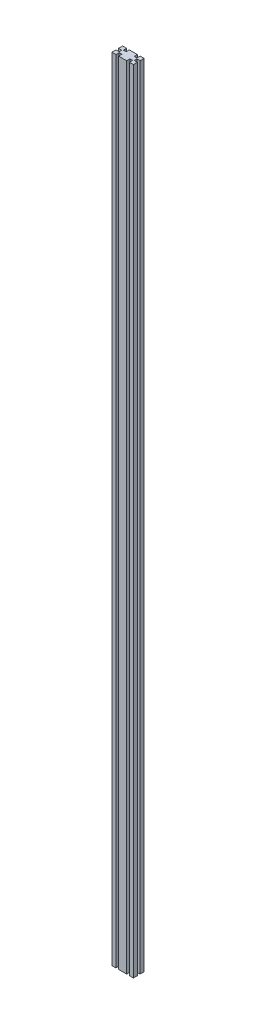
ISO-10303-21;
HEADER;
FILE_DESCRIPTION(('STEP AP214'),'2;1');
FILE_NAME('part.step','',(''),(''),'','','');
FILE_SCHEMA(('AUTOMOTIVE_DESIGN { 1 0 10303 214 1 1 1 1 }'));
ENDSEC;
DATA;
#1=APPLICATION_CONTEXT('core data for automotive mechanical design processes');
#2=APPLICATION_PROTOCOL_DEFINITION('international standard','automotive_design',2000,#1);
#3=PRODUCT_CONTEXT('',#1,'mechanical');
#4=PRODUCT('Part','Part','',(#3));
#5=PRODUCT_RELATED_PRODUCT_CATEGORY('part','',(#4));
#6=PRODUCT_DEFINITION_FORMATION('','',#4);
#7=PRODUCT_DEFINITION_CONTEXT('part definition',#1,'design');
#8=PRODUCT_DEFINITION('design','',#6,#7);
#9=PRODUCT_DEFINITION_SHAPE('','',#8);
#10=(LENGTH_UNIT() NAMED_UNIT(*) SI_UNIT(.MILLI.,.METRE.));
#11=(NAMED_UNIT(*) PLANE_ANGLE_UNIT() SI_UNIT($,.RADIAN.));
#12=(NAMED_UNIT(*) SI_UNIT($,.STERADIAN.) SOLID_ANGLE_UNIT());
#13=UNCERTAINTY_MEASURE_WITH_UNIT(LENGTH_MEASURE(1.E-05),#10,'distance_accuracy_value','');
#14=(GEOMETRIC_REPRESENTATION_CONTEXT(3) GLOBAL_UNCERTAINTY_ASSIGNED_CONTEXT((#13)) GLOBAL_UNIT_ASSIGNED_CONTEXT((#10,
#11,#12)) REPRESENTATION_CONTEXT('',''));
#15=CARTESIAN_POINT('',(0.,0.,0.));
#16=DIRECTION('',(0.,0.,1.));
#17=DIRECTION('',(1.,0.,0.));
#18=AXIS2_PLACEMENT_3D('',#15,#16,#17);
#19=CARTESIAN_POINT('',(20.,-736.6,10.));
#20=DIRECTION('',(1.,0.,0.));
#21=DIRECTION('',(0.,0.,-1.));
#22=AXIS2_PLACEMENT_3D('',#19,#20,#21);
#23=PLANE('',#22);
#24=DIRECTION('',(0.,0.,-1.));
#25=VECTOR('',#24,1.);
#26=CARTESIAN_POINT('',(20.,736.6,10.));
#27=LINE('',#26,#25);
#28=CARTESIAN_POINT('',(20.,736.6,-2.5));
#29=VERTEX_POINT('',#28);
#30=CARTESIAN_POINT('',(20.,736.6,-10.));
#31=VERTEX_POINT('',#30);
#32=EDGE_CURVE('E374',#29,#31,#27,.T.);
#33=ORIENTED_EDGE('',*,*,#32,.F.);
#34=DIRECTION('',(0.,-1.,0.));
#35=VECTOR('',#34,1.);
#36=CARTESIAN_POINT('',(20.,-736.6,-2.5));
#37=LINE('',#36,#35);
#38=CARTESIAN_POINT('',(20.,-736.6,-2.5));
#39=VERTEX_POINT('',#38);
#40=EDGE_CURVE('E356',#29,#39,#37,.T.);
#41=ORIENTED_EDGE('',*,*,#40,.T.);
#42=DIRECTION('',(0.,0.,-1.));
#43=VECTOR('',#42,1.);
#44=CARTESIAN_POINT('',(20.,-736.6,10.));
#45=LINE('',#44,#43);
#46=CARTESIAN_POINT('',(20.,-736.6,-10.));
#47=VERTEX_POINT('',#46);
#48=EDGE_CURVE('E391',#39,#47,#45,.T.);
#49=ORIENTED_EDGE('',*,*,#48,.T.);
#50=DIRECTION('',(0.,1.,0.));
#51=VECTOR('',#50,1.);
#52=CARTESIAN_POINT('',(20.,-736.6,-10.));
#53=LINE('',#52,#51);
#54=EDGE_CURVE('E36',#47,#31,#53,.T.);
#55=ORIENTED_EDGE('',*,*,#54,.T.);
#56=EDGE_LOOP('',(#33,#41,#49,#55));
#57=FACE_BOUND('',#56,.T.);
#58=ADVANCED_FACE('F32',(#57),#23,.T.);
#59=CARTESIAN_POINT('',(-20.,-736.6,10.));
#60=DIRECTION('',(0.,0.,1.));
#61=DIRECTION('',(1.,0.,0.));
#62=AXIS2_PLACEMENT_3D('',#59,#60,#61);
#63=PLANE('',#62);
#64=DIRECTION('',(1.,0.,0.));
#65=VECTOR('',#64,1.);
#66=CARTESIAN_POINT('',(-20.,736.6,10.));
#67=LINE('',#66,#65);
#68=CARTESIAN_POINT('',(-7.5,736.6,10.));
#69=VERTEX_POINT('',#68);
#70=CARTESIAN_POINT('',(7.5,736.6,10.));
#71=VERTEX_POINT('',#70);
#72=EDGE_CURVE('E392',#69,#71,#67,.T.);
#73=ORIENTED_EDGE('',*,*,#72,.F.);
#74=DIRECTION('',(0.,-1.,0.));
#75=VECTOR('',#74,1.);
#76=CARTESIAN_POINT('',(-7.5,-736.6,10.));
#77=LINE('',#76,#75);
#78=CARTESIAN_POINT('',(-7.5,-736.6,10.));
#79=VERTEX_POINT('',#78);
#80=EDGE_CURVE('E371',#69,#79,#77,.T.);
#81=ORIENTED_EDGE('',*,*,#80,.T.);
#82=DIRECTION('',(1.,0.,0.));
#83=VECTOR('',#82,1.);
#84=CARTESIAN_POINT('',(-20.,-736.6,10.));
#85=LINE('',#84,#83);
#86=CARTESIAN_POINT('',(7.5,-736.6,10.));
#87=VERTEX_POINT('',#86);
#88=EDGE_CURVE('E408',#79,#87,#85,.T.);
#89=ORIENTED_EDGE('',*,*,#88,.T.);
#90=DIRECTION('',(0.,-1.,0.));
#91=VECTOR('',#90,1.);
#92=CARTESIAN_POINT('',(7.5,-736.6,10.));
#93=LINE('',#92,#91);
#94=EDGE_CURVE('E351',#71,#87,#93,.T.);
#95=ORIENTED_EDGE('',*,*,#94,.F.);
#96=EDGE_LOOP('',(#73,#81,#89,#95));
#97=FACE_BOUND('',#96,.T.);
#98=ADVANCED_FACE('F492',(#97),#63,.T.);
#99=CARTESIAN_POINT('',(12.5,736.6,10.));
#100=VERTEX_POINT('',#99);
#101=CARTESIAN_POINT('',(20.,736.6,10.));
#102=VERTEX_POINT('',#101);
#103=EDGE_CURVE('E387',#100,#102,#67,.T.);
#104=ORIENTED_EDGE('',*,*,#103,.F.);
#105=DIRECTION('',(0.,-1.,0.));
#106=VECTOR('',#105,1.);
#107=CARTESIAN_POINT('',(12.5,-736.6,10.));
#108=LINE('',#107,#106);
#109=CARTESIAN_POINT('',(12.5,-736.6,10.));
#110=VERTEX_POINT('',#109);
#111=EDGE_CURVE('E235',#100,#110,#108,.T.);
#112=ORIENTED_EDGE('',*,*,#111,.T.);
#113=CARTESIAN_POINT('',(20.,-736.6,10.));
#114=VERTEX_POINT('',#113);
#115=EDGE_CURVE('E405',#110,#114,#85,.T.);
#116=ORIENTED_EDGE('',*,*,#115,.T.);
#117=DIRECTION('',(0.,1.,0.));
#118=VECTOR('',#117,1.);
#119=CARTESIAN_POINT('',(20.,-736.6,10.));
#120=LINE('',#119,#118);
#121=EDGE_CURVE('E11',#114,#102,#120,.T.);
#122=ORIENTED_EDGE('',*,*,#121,.T.);
#123=EDGE_LOOP('',(#104,#112,#116,#122));
#124=FACE_BOUND('',#123,.T.);
#125=ADVANCED_FACE('F496',(#124),#63,.T.);
#126=CARTESIAN_POINT('',(-20.,-736.6,10.));
#127=DIRECTION('',(-1.,0.,0.));
#128=DIRECTION('',(0.,0.,1.));
#129=AXIS2_PLACEMENT_3D('',#126,#127,#128);
#130=PLANE('',#129);
#131=DIRECTION('',(0.,0.,1.));
#132=VECTOR('',#131,1.);
#133=CARTESIAN_POINT('',(-20.,736.6,10.));
#134=LINE('',#133,#132);
#135=CARTESIAN_POINT('',(-20.,736.6,2.5));
#136=VERTEX_POINT('',#135);
#137=CARTESIAN_POINT('',(-20.,736.6,10.));
#138=VERTEX_POINT('',#137);
#139=EDGE_CURVE('E382',#136,#138,#134,.T.);
#140=ORIENTED_EDGE('',*,*,#139,.F.);
#141=DIRECTION('',(0.,-1.,0.));
#142=VECTOR('',#141,1.);
#143=CARTESIAN_POINT('',(-20.,-736.6,2.5));
#144=LINE('',#143,#142);
#145=CARTESIAN_POINT('',(-20.,-736.6,2.5));
#146=VERTEX_POINT('',#145);
#147=EDGE_CURVE('E364',#136,#146,#144,.T.);
#148=ORIENTED_EDGE('',*,*,#147,.T.);
#149=DIRECTION('',(0.,0.,1.));
#150=VECTOR('',#149,1.);
#151=CARTESIAN_POINT('',(-20.,-736.6,10.));
#152=LINE('',#151,#150);
#153=CARTESIAN_POINT('',(-20.,-736.6,10.));
#154=VERTEX_POINT('',#153);
#155=EDGE_CURVE('E400',#146,#154,#152,.T.);
#156=ORIENTED_EDGE('',*,*,#155,.T.);
#157=DIRECTION('',(0.,1.,0.));
#158=VECTOR('',#157,1.);
#159=CARTESIAN_POINT('',(-20.,-736.6,10.));
#160=LINE('',#159,#158);
#161=EDGE_CURVE('E41',#154,#138,#160,.T.);
#162=ORIENTED_EDGE('',*,*,#161,.T.);
#163=EDGE_LOOP('',(#140,#148,#156,#162));
#164=FACE_BOUND('',#163,.T.);
#165=ADVANCED_FACE('F688',(#164),#130,.T.);
#166=CARTESIAN_POINT('',(-20.,-736.6,-10.));
#167=DIRECTION('',(0.,0.,-1.));
#168=DIRECTION('',(-1.,0.,0.));
#169=AXIS2_PLACEMENT_3D('',#166,#167,#168);
#170=PLANE('',#169);
#171=DIRECTION('',(-1.,0.,0.));
#172=VECTOR('',#171,1.);
#173=CARTESIAN_POINT('',(-20.,736.6,-10.));
#174=LINE('',#173,#172);
#175=CARTESIAN_POINT('',(7.5,736.6,-10.));
#176=VERTEX_POINT('',#175);
#177=CARTESIAN_POINT('',(-7.5,736.6,-10.));
#178=VERTEX_POINT('',#177);
#179=EDGE_CURVE('E383',#176,#178,#174,.T.);
#180=ORIENTED_EDGE('',*,*,#179,.F.);
#181=DIRECTION('',(0.,-1.,0.));
#182=VECTOR('',#181,1.);
#183=CARTESIAN_POINT('',(7.5,-736.6,-10.));
#184=LINE('',#183,#182);
#185=CARTESIAN_POINT('',(7.5,-736.6,-10.));
#186=VERTEX_POINT('',#185);
#187=EDGE_CURVE('E361',#176,#186,#184,.T.);
#188=ORIENTED_EDGE('',*,*,#187,.T.);
#189=DIRECTION('',(-1.,0.,0.));
#190=VECTOR('',#189,1.);
#191=CARTESIAN_POINT('',(-20.,-736.6,-10.));
#192=LINE('',#191,#190);
#193=CARTESIAN_POINT('',(-7.5,-736.6,-10.));
#194=VERTEX_POINT('',#193);
#195=EDGE_CURVE('E401',#186,#194,#192,.T.);
#196=ORIENTED_EDGE('',*,*,#195,.T.);
#197=DIRECTION('',(0.,-1.,0.));
#198=VECTOR('',#197,1.);
#199=CARTESIAN_POINT('',(-7.5,-736.6,-10.));
#200=LINE('',#199,#198);
#201=EDGE_CURVE('E344',#178,#194,#200,.T.);
#202=ORIENTED_EDGE('',*,*,#201,.F.);
#203=EDGE_LOOP('',(#180,#188,#196,#202));
#204=FACE_BOUND('',#203,.T.);
#205=ADVANCED_FACE('F474',(#204),#170,.T.);
#206=CARTESIAN_POINT('',(-12.5,736.6,-10.));
#207=VERTEX_POINT('',#206);
#208=CARTESIAN_POINT('',(-20.,736.6,-10.));
#209=VERTEX_POINT('',#208);
#210=EDGE_CURVE('E378',#207,#209,#174,.T.);
#211=ORIENTED_EDGE('',*,*,#210,.F.);
#212=DIRECTION('',(0.,-1.,0.));
#213=VECTOR('',#212,1.);
#214=CARTESIAN_POINT('',(-12.5,-736.6,-10.));
#215=LINE('',#214,#213);
#216=CARTESIAN_POINT('',(-12.5,-736.6,-10.));
#217=VERTEX_POINT('',#216);
#218=EDGE_CURVE('E348',#207,#217,#215,.T.);
#219=ORIENTED_EDGE('',*,*,#218,.T.);
#220=CARTESIAN_POINT('',(-20.,-736.6,-10.));
#221=VERTEX_POINT('',#220);
#222=EDGE_CURVE('E396',#217,#221,#192,.T.);
#223=ORIENTED_EDGE('',*,*,#222,.T.);
#224=DIRECTION('',(0.,1.,0.));
#225=VECTOR('',#224,1.);
#226=CARTESIAN_POINT('',(-20.,-736.6,-10.));
#227=LINE('',#226,#225);
#228=EDGE_CURVE('E411',#221,#209,#227,.T.);
#229=ORIENTED_EDGE('',*,*,#228,.T.);
#230=EDGE_LOOP('',(#211,#219,#223,#229));
#231=FACE_BOUND('',#230,.T.);
#232=ADVANCED_FACE('F456',(#231),#170,.T.);
#233=CARTESIAN_POINT('',(0.,-736.6,0.));
#234=DIRECTION('',(0.,-1.,0.));
#235=DIRECTION('',(0.,0.,-1.));
#236=AXIS2_PLACEMENT_3D('',#233,#234,#235);
#237=PLANE('',#236);
#238=ORIENTED_EDGE('',*,*,#88,.F.);
#239=DIRECTION('',(0.,0.,1.));
#240=VECTOR('',#239,1.);
#241=CARTESIAN_POINT('',(-7.5,-736.6,0.));
#242=LINE('',#241,#240);
#243=CARTESIAN_POINT('',(-7.5,-736.6,4.));
#244=VERTEX_POINT('',#243);
#245=EDGE_CURVE('E265',#244,#79,#242,.T.);
#246=ORIENTED_EDGE('',*,*,#245,.F.);
#247=DIRECTION('',(1.,0.,0.));
#248=VECTOR('',#247,1.);
#249=CARTESIAN_POINT('',(0.,-736.6,4.));
#250=LINE('',#249,#248);
#251=CARTESIAN_POINT('',(-12.5,-736.6,4.));
#252=VERTEX_POINT('',#251);
#253=EDGE_CURVE('E260',#252,#244,#250,.T.);
#254=ORIENTED_EDGE('',*,*,#253,.F.);
#255=DIRECTION('',(0.,0.,1.));
#256=VECTOR('',#255,1.);
#257=CARTESIAN_POINT('',(-12.5,-736.6,0.));
#258=LINE('',#257,#256);
#259=CARTESIAN_POINT('',(-12.5,-736.6,10.));
#260=VERTEX_POINT('',#259);
#261=EDGE_CURVE('E262',#252,#260,#258,.T.);
#262=ORIENTED_EDGE('',*,*,#261,.T.);
#263=EDGE_CURVE('E406',#154,#260,#85,.T.);
#264=ORIENTED_EDGE('',*,*,#263,.F.);
#265=ORIENTED_EDGE('',*,*,#155,.F.);
#266=DIRECTION('',(-1.,0.,0.));
#267=VECTOR('',#266,1.);
#268=CARTESIAN_POINT('',(0.,-736.6,2.5));
#269=LINE('',#268,#267);
#270=CARTESIAN_POINT('',(-14.,-736.6,2.5));
#271=VERTEX_POINT('',#270);
#272=EDGE_CURVE('E284',#271,#146,#269,.T.);
#273=ORIENTED_EDGE('',*,*,#272,.F.);
#274=DIRECTION('',(0.,0.,1.));
#275=VECTOR('',#274,1.);
#276=CARTESIAN_POINT('',(-14.,-736.6,0.));
#277=LINE('',#276,#275);
#278=CARTESIAN_POINT('',(-14.,-736.6,-2.5));
#279=VERTEX_POINT('',#278);
#280=EDGE_CURVE('E286',#279,#271,#277,.T.);
#281=ORIENTED_EDGE('',*,*,#280,.F.);
#282=DIRECTION('',(-1.,0.,0.));
#283=VECTOR('',#282,1.);
#284=CARTESIAN_POINT('',(0.,-736.6,-2.5));
#285=LINE('',#284,#283);
#286=CARTESIAN_POINT('',(-20.,-736.6,-2.5));
#287=VERTEX_POINT('',#286);
#288=EDGE_CURVE('E281',#279,#287,#285,.T.);
#289=ORIENTED_EDGE('',*,*,#288,.T.);
#290=EDGE_CURVE('E402',#221,#287,#152,.T.);
#291=ORIENTED_EDGE('',*,*,#290,.F.);
#292=ORIENTED_EDGE('',*,*,#222,.F.);
#293=DIRECTION('',(0.,0.,-1.));
#294=VECTOR('',#293,1.);
#295=CARTESIAN_POINT('',(-12.5,-736.6,0.));
#296=LINE('',#295,#294);
#297=CARTESIAN_POINT('',(-12.5,-736.6,-4.));
#298=VERTEX_POINT('',#297);
#299=EDGE_CURVE('E339',#298,#217,#296,.T.);
#300=ORIENTED_EDGE('',*,*,#299,.F.);
#301=DIRECTION('',(1.,0.,0.));
#302=VECTOR('',#301,1.);
#303=CARTESIAN_POINT('',(0.,-736.6,-4.));
#304=LINE('',#303,#302);
#305=CARTESIAN_POINT('',(-7.5,-736.6,-4.));
#306=VERTEX_POINT('',#305);
#307=EDGE_CURVE('E333',#298,#306,#304,.T.);
#308=ORIENTED_EDGE('',*,*,#307,.T.);
#309=DIRECTION('',(0.,0.,-1.));
#310=VECTOR('',#309,1.);
#311=CARTESIAN_POINT('',(-7.5,-736.6,0.));
#312=LINE('',#311,#310);
#313=EDGE_CURVE('E336',#306,#194,#312,.T.);
#314=ORIENTED_EDGE('',*,*,#313,.T.);
#315=ORIENTED_EDGE('',*,*,#195,.F.);
#316=DIRECTION('',(0.,0.,-1.));
#317=VECTOR('',#316,1.);
#318=CARTESIAN_POINT('',(7.5,-736.6,0.));
#319=LINE('',#318,#317);
#320=CARTESIAN_POINT('',(7.5,-736.6,-4.));
#321=VERTEX_POINT('',#320);
#322=EDGE_CURVE('E303',#321,#186,#319,.T.);
#323=ORIENTED_EDGE('',*,*,#322,.F.);
#324=DIRECTION('',(-1.,0.,0.));
#325=VECTOR('',#324,1.);
#326=CARTESIAN_POINT('',(0.,-736.6,-4.));
#327=LINE('',#326,#325);
#328=CARTESIAN_POINT('',(12.5,-736.6,-4.));
#329=VERTEX_POINT('',#328);
#330=EDGE_CURVE('E298',#329,#321,#327,.T.);
#331=ORIENTED_EDGE('',*,*,#330,.F.);
#332=DIRECTION('',(0.,0.,-1.));
#333=VECTOR('',#332,1.);
#334=CARTESIAN_POINT('',(12.5,-736.6,0.));
#335=LINE('',#334,#333);
#336=CARTESIAN_POINT('',(12.5,-736.6,-10.));
#337=VERTEX_POINT('',#336);
#338=EDGE_CURVE('E300',#329,#337,#335,.T.);
#339=ORIENTED_EDGE('',*,*,#338,.T.);
#340=EDGE_CURVE('E397',#47,#337,#192,.T.);
#341=ORIENTED_EDGE('',*,*,#340,.F.);
#342=ORIENTED_EDGE('',*,*,#48,.F.);
#343=DIRECTION('',(1.,0.,0.));
#344=VECTOR('',#343,1.);
#345=CARTESIAN_POINT('',(0.,-736.6,-2.5));
#346=LINE('',#345,#344);
#347=CARTESIAN_POINT('',(14.,-736.6,-2.5));
#348=VERTEX_POINT('',#347);
#349=EDGE_CURVE('E315',#348,#39,#346,.T.);
#350=ORIENTED_EDGE('',*,*,#349,.F.);
#351=DIRECTION('',(0.,0.,1.));
#352=VECTOR('',#351,1.);
#353=CARTESIAN_POINT('',(14.,-736.6,0.));
#354=LINE('',#353,#352);
#355=CARTESIAN_POINT('',(14.,-736.6,2.5));
#356=VERTEX_POINT('',#355);
#357=EDGE_CURVE('E317',#348,#356,#354,.T.);
#358=ORIENTED_EDGE('',*,*,#357,.T.);
#359=DIRECTION('',(1.,0.,0.));
#360=VECTOR('',#359,1.);
#361=CARTESIAN_POINT('',(0.,-736.6,2.5));
#362=LINE('',#361,#360);
#363=CARTESIAN_POINT('',(20.,-736.6,2.5));
#364=VERTEX_POINT('',#363);
#365=EDGE_CURVE('E320',#356,#364,#362,.T.);
#366=ORIENTED_EDGE('',*,*,#365,.T.);
#367=EDGE_CURVE('E393',#114,#364,#45,.T.);
#368=ORIENTED_EDGE('',*,*,#367,.F.);
#369=ORIENTED_EDGE('',*,*,#115,.F.);
#370=DIRECTION('',(0.,0.,1.));
#371=VECTOR('',#370,1.);
#372=CARTESIAN_POINT('',(12.5,-736.6,0.));
#373=LINE('',#372,#371);
#374=CARTESIAN_POINT('',(12.5,-736.6,4.));
#375=VERTEX_POINT('',#374);
#376=EDGE_CURVE('E251',#375,#110,#373,.T.);
#377=ORIENTED_EDGE('',*,*,#376,.F.);
#378=DIRECTION('',(-1.,0.,0.));
#379=VECTOR('',#378,1.);
#380=CARTESIAN_POINT('',(0.,-736.6,4.));
#381=LINE('',#380,#379);
#382=CARTESIAN_POINT('',(7.5,-736.6,4.));
#383=VERTEX_POINT('',#382);
#384=EDGE_CURVE('E225',#375,#383,#381,.T.);
#385=ORIENTED_EDGE('',*,*,#384,.T.);
#386=DIRECTION('',(0.,0.,1.));
#387=VECTOR('',#386,1.);
#388=CARTESIAN_POINT('',(7.5,-736.6,0.));
#389=LINE('',#388,#387);
#390=EDGE_CURVE('E248',#383,#87,#389,.T.);
#391=ORIENTED_EDGE('',*,*,#390,.T.);
#392=EDGE_LOOP('',(#238,#246,#254,#262,#264,#265,#273,#281,#289,#291,#292,#300,#308,#314,#315,
#323,#331,#339,#341,#342,#350,#358,#366,#368,#369,#377,#385,#391));
#393=FACE_BOUND('',#392,.T.);
#394=ADVANCED_FACE('F439',(#393),#237,.T.);
#395=CARTESIAN_POINT('',(0.,736.6,0.));
#396=DIRECTION('',(0.,-1.,0.));
#397=DIRECTION('',(0.,0.,-1.));
#398=AXIS2_PLACEMENT_3D('',#395,#396,#397);
#399=PLANE('',#398);
#400=DIRECTION('',(0.,0.,1.));
#401=VECTOR('',#400,1.);
#402=CARTESIAN_POINT('',(-7.5,736.6,0.));
#403=LINE('',#402,#401);
#404=CARTESIAN_POINT('',(-7.5,736.6,4.));
#405=VERTEX_POINT('',#404);
#406=EDGE_CURVE('E258',#405,#69,#403,.T.);
#407=ORIENTED_EDGE('',*,*,#406,.T.);
#408=ORIENTED_EDGE('',*,*,#72,.T.);
#409=DIRECTION('',(0.,0.,1.));
#410=VECTOR('',#409,1.);
#411=CARTESIAN_POINT('',(7.5,736.6,0.));
#412=LINE('',#411,#410);
#413=CARTESIAN_POINT('',(7.5,736.6,4.));
#414=VERTEX_POINT('',#413);
#415=EDGE_CURVE('E238',#414,#71,#412,.T.);
#416=ORIENTED_EDGE('',*,*,#415,.F.);
#417=DIRECTION('',(-1.,0.,0.));
#418=VECTOR('',#417,1.);
#419=CARTESIAN_POINT('',(0.,736.6,4.));
#420=LINE('',#419,#418);
#421=CARTESIAN_POINT('',(12.5,736.6,4.));
#422=VERTEX_POINT('',#421);
#423=EDGE_CURVE('E222',#422,#414,#420,.T.);
#424=ORIENTED_EDGE('',*,*,#423,.F.);
#425=DIRECTION('',(0.,0.,1.));
#426=VECTOR('',#425,1.);
#427=CARTESIAN_POINT('',(12.5,736.6,0.));
#428=LINE('',#427,#426);
#429=EDGE_CURVE('E232',#422,#100,#428,.T.);
#430=ORIENTED_EDGE('',*,*,#429,.T.);
#431=ORIENTED_EDGE('',*,*,#103,.T.);
#432=CARTESIAN_POINT('',(20.,736.6,2.5));
#433=VERTEX_POINT('',#432);
#434=EDGE_CURVE('E375',#102,#433,#27,.T.);
#435=ORIENTED_EDGE('',*,*,#434,.T.);
#436=DIRECTION('',(1.,0.,0.));
#437=VECTOR('',#436,1.);
#438=CARTESIAN_POINT('',(0.,736.6,2.5));
#439=LINE('',#438,#437);
#440=CARTESIAN_POINT('',(14.,736.6,2.5));
#441=VERTEX_POINT('',#440);
#442=EDGE_CURVE('E313',#441,#433,#439,.T.);
#443=ORIENTED_EDGE('',*,*,#442,.F.);
#444=DIRECTION('',(0.,0.,1.));
#445=VECTOR('',#444,1.);
#446=CARTESIAN_POINT('',(14.,736.6,0.));
#447=LINE('',#446,#445);
#448=CARTESIAN_POINT('',(14.,736.6,-2.5));
#449=VERTEX_POINT('',#448);
#450=EDGE_CURVE('E310',#449,#441,#447,.T.);
#451=ORIENTED_EDGE('',*,*,#450,.F.);
#452=DIRECTION('',(1.,0.,0.));
#453=VECTOR('',#452,1.);
#454=CARTESIAN_POINT('',(0.,736.6,-2.5));
#455=LINE('',#454,#453);
#456=EDGE_CURVE('E228',#449,#29,#455,.T.);
#457=ORIENTED_EDGE('',*,*,#456,.T.);
#458=ORIENTED_EDGE('',*,*,#32,.T.);
#459=CARTESIAN_POINT('',(12.5,736.6,-10.));
#460=VERTEX_POINT('',#459);
#461=EDGE_CURVE('E379',#31,#460,#174,.T.);
#462=ORIENTED_EDGE('',*,*,#461,.T.);
#463=DIRECTION('',(0.,0.,-1.));
#464=VECTOR('',#463,1.);
#465=CARTESIAN_POINT('',(12.5,736.6,0.));
#466=LINE('',#465,#464);
#467=CARTESIAN_POINT('',(12.5,736.6,-4.));
#468=VERTEX_POINT('',#467);
#469=EDGE_CURVE('E292',#468,#460,#466,.T.);
#470=ORIENTED_EDGE('',*,*,#469,.F.);
#471=DIRECTION('',(-1.,0.,0.));
#472=VECTOR('',#471,1.);
#473=CARTESIAN_POINT('',(0.,736.6,-4.));
#474=LINE('',#473,#472);
#475=CARTESIAN_POINT('',(7.5,736.6,-4.));
#476=VERTEX_POINT('',#475);
#477=EDGE_CURVE('E57',#468,#476,#474,.T.);
#478=ORIENTED_EDGE('',*,*,#477,.T.);
#479=DIRECTION('',(0.,0.,-1.));
#480=VECTOR('',#479,1.);
#481=CARTESIAN_POINT('',(7.5,736.6,0.));
#482=LINE('',#481,#480);
#483=EDGE_CURVE('E295',#476,#176,#482,.T.);
#484=ORIENTED_EDGE('',*,*,#483,.T.);
#485=ORIENTED_EDGE('',*,*,#179,.T.);
#486=DIRECTION('',(0.,0.,-1.));
#487=VECTOR('',#486,1.);
#488=CARTESIAN_POINT('',(-7.5,736.6,0.));
#489=LINE('',#488,#487);
#490=CARTESIAN_POINT('',(-7.5,736.6,-4.));
#491=VERTEX_POINT('',#490);
#492=EDGE_CURVE('E328',#491,#178,#489,.T.);
#493=ORIENTED_EDGE('',*,*,#492,.F.);
#494=DIRECTION('',(1.,0.,0.));
#495=VECTOR('',#494,1.);
#496=CARTESIAN_POINT('',(0.,736.6,-4.));
#497=LINE('',#496,#495);
#498=CARTESIAN_POINT('',(-12.5,736.6,-4.));
#499=VERTEX_POINT('',#498);
#500=EDGE_CURVE('E270',#499,#491,#497,.T.);
#501=ORIENTED_EDGE('',*,*,#500,.F.);
#502=DIRECTION('',(0.,0.,-1.));
#503=VECTOR('',#502,1.);
#504=CARTESIAN_POINT('',(-12.5,736.6,0.));
#505=LINE('',#504,#503);
#506=EDGE_CURVE('E330',#499,#207,#505,.T.);
#507=ORIENTED_EDGE('',*,*,#506,.T.);
#508=ORIENTED_EDGE('',*,*,#210,.T.);
#509=CARTESIAN_POINT('',(-20.,736.6,-2.5));
#510=VERTEX_POINT('',#509);
#511=EDGE_CURVE('E384',#209,#510,#134,.T.);
#512=ORIENTED_EDGE('',*,*,#511,.T.);
#513=DIRECTION('',(-1.,0.,0.));
#514=VECTOR('',#513,1.);
#515=CARTESIAN_POINT('',(0.,736.6,-2.5));
#516=LINE('',#515,#514);
#517=CARTESIAN_POINT('',(-14.,736.6,-2.5));
#518=VERTEX_POINT('',#517);
#519=EDGE_CURVE('E272',#518,#510,#516,.T.);
#520=ORIENTED_EDGE('',*,*,#519,.F.);
#521=DIRECTION('',(0.,0.,1.));
#522=VECTOR('',#521,1.);
#523=CARTESIAN_POINT('',(-14.,736.6,0.));
#524=LINE('',#523,#522);
#525=CARTESIAN_POINT('',(-14.,736.6,2.5));
#526=VERTEX_POINT('',#525);
#527=EDGE_CURVE('E278',#518,#526,#524,.T.);
#528=ORIENTED_EDGE('',*,*,#527,.T.);
#529=DIRECTION('',(-1.,0.,0.));
#530=VECTOR('',#529,1.);
#531=CARTESIAN_POINT('',(0.,736.6,2.5));
#532=LINE('',#531,#530);
#533=EDGE_CURVE('E274',#526,#136,#532,.T.);
#534=ORIENTED_EDGE('',*,*,#533,.T.);
#535=ORIENTED_EDGE('',*,*,#139,.T.);
#536=CARTESIAN_POINT('',(-12.5,736.6,10.));
#537=VERTEX_POINT('',#536);
#538=EDGE_CURVE('E388',#138,#537,#67,.T.);
#539=ORIENTED_EDGE('',*,*,#538,.T.);
#540=DIRECTION('',(0.,0.,1.));
#541=VECTOR('',#540,1.);
#542=CARTESIAN_POINT('',(-12.5,736.6,0.));
#543=LINE('',#542,#541);
#544=CARTESIAN_POINT('',(-12.5,736.6,4.));
#545=VERTEX_POINT('',#544);
#546=EDGE_CURVE('E255',#545,#537,#543,.T.);
#547=ORIENTED_EDGE('',*,*,#546,.F.);
#548=DIRECTION('',(1.,0.,0.));
#549=VECTOR('',#548,1.);
#550=CARTESIAN_POINT('',(0.,736.6,4.));
#551=LINE('',#550,#549);
#552=EDGE_CURVE('E49',#545,#405,#551,.T.);
#553=ORIENTED_EDGE('',*,*,#552,.T.);
#554=EDGE_LOOP('',(#407,#408,#416,#424,#430,#431,#435,#443,#451,#457,#458,#462,#470,#478,#484,
#485,#493,#501,#507,#508,#512,#520,#528,#534,#535,#539,#547,#553));
#555=FACE_BOUND('',#554,.T.);
#556=ADVANCED_FACE('F242',(#555),#399,.F.);
#557=DIRECTION('',(0.,-1.,0.));
#558=VECTOR('',#557,1.);
#559=CARTESIAN_POINT('',(20.,-736.6,2.5));
#560=LINE('',#559,#558);
#561=EDGE_CURVE('E354',#433,#364,#560,.T.);
#562=ORIENTED_EDGE('',*,*,#561,.F.);
#563=ORIENTED_EDGE('',*,*,#434,.F.);
#564=ORIENTED_EDGE('',*,*,#121,.F.);
#565=ORIENTED_EDGE('',*,*,#367,.T.);
#566=EDGE_LOOP('',(#562,#563,#564,#565));
#567=FACE_BOUND('',#566,.T.);
#568=ADVANCED_FACE('F34',(#567),#23,.T.);
#569=DIRECTION('',(0.,-1.,0.));
#570=VECTOR('',#569,1.);
#571=CARTESIAN_POINT('',(-12.5,-736.6,10.));
#572=LINE('',#571,#570);
#573=EDGE_CURVE('E369',#537,#260,#572,.T.);
#574=ORIENTED_EDGE('',*,*,#573,.F.);
#575=ORIENTED_EDGE('',*,*,#538,.F.);
#576=ORIENTED_EDGE('',*,*,#161,.F.);
#577=ORIENTED_EDGE('',*,*,#263,.T.);
#578=EDGE_LOOP('',(#574,#575,#576,#577));
#579=FACE_BOUND('',#578,.T.);
#580=ADVANCED_FACE('F499',(#579),#63,.T.);
#581=DIRECTION('',(0.,-1.,0.));
#582=VECTOR('',#581,1.);
#583=CARTESIAN_POINT('',(-20.,-736.6,-2.5));
#584=LINE('',#583,#582);
#585=EDGE_CURVE('E367',#510,#287,#584,.T.);
#586=ORIENTED_EDGE('',*,*,#585,.F.);
#587=ORIENTED_EDGE('',*,*,#511,.F.);
#588=ORIENTED_EDGE('',*,*,#228,.F.);
#589=ORIENTED_EDGE('',*,*,#290,.T.);
#590=EDGE_LOOP('',(#586,#587,#588,#589));
#591=FACE_BOUND('',#590,.T.);
#592=ADVANCED_FACE('F461',(#591),#130,.T.);
#593=DIRECTION('',(0.,-1.,0.));
#594=VECTOR('',#593,1.);
#595=CARTESIAN_POINT('',(12.5,-736.6,-10.));
#596=LINE('',#595,#594);
#597=EDGE_CURVE('E359',#460,#337,#596,.T.);
#598=ORIENTED_EDGE('',*,*,#597,.F.);
#599=ORIENTED_EDGE('',*,*,#461,.F.);
#600=ORIENTED_EDGE('',*,*,#54,.F.);
#601=ORIENTED_EDGE('',*,*,#340,.T.);
#602=EDGE_LOOP('',(#598,#599,#600,#601));
#603=FACE_BOUND('',#602,.T.);
#604=ADVANCED_FACE('F426',(#603),#170,.T.);
#605=CARTESIAN_POINT('',(0.,-736.6,-4.));
#606=DIRECTION('',(0.,0.,1.));
#607=DIRECTION('',(1.,0.,0.));
#608=AXIS2_PLACEMENT_3D('',#605,#606,#607);
#609=PLANE('',#608);
#610=DIRECTION('',(0.,1.,0.));
#611=VECTOR('',#610,1.);
#612=CARTESIAN_POINT('',(-7.5,-736.6,-4.));
#613=LINE('',#612,#611);
#614=EDGE_CURVE('E341',#306,#491,#613,.T.);
#615=ORIENTED_EDGE('',*,*,#614,.F.);
#616=ORIENTED_EDGE('',*,*,#307,.F.);
#617=DIRECTION('',(0.,1.,0.));
#618=VECTOR('',#617,1.);
#619=CARTESIAN_POINT('',(-12.5,-736.6,-4.));
#620=LINE('',#619,#618);
#621=EDGE_CURVE('E342',#298,#499,#620,.T.);
#622=ORIENTED_EDGE('',*,*,#621,.T.);
#623=ORIENTED_EDGE('',*,*,#500,.T.);
#624=EDGE_LOOP('',(#615,#616,#622,#623));
#625=FACE_BOUND('',#624,.T.);
#626=ADVANCED_FACE('F479',(#625),#609,.F.);
#627=CARTESIAN_POINT('',(-12.5,-736.6,0.));
#628=DIRECTION('',(1.,0.,0.));
#629=DIRECTION('',(0.,0.,-1.));
#630=AXIS2_PLACEMENT_3D('',#627,#628,#629);
#631=PLANE('',#630);
#632=ORIENTED_EDGE('',*,*,#506,.F.);
#633=ORIENTED_EDGE('',*,*,#621,.F.);
#634=ORIENTED_EDGE('',*,*,#299,.T.);
#635=ORIENTED_EDGE('',*,*,#218,.F.);
#636=EDGE_LOOP('',(#632,#633,#634,#635));
#637=FACE_BOUND('',#636,.T.);
#638=ADVANCED_FACE('F481',(#637),#631,.T.);
#639=CARTESIAN_POINT('',(-7.5,-736.6,0.));
#640=DIRECTION('',(1.,0.,0.));
#641=DIRECTION('',(0.,0.,-1.));
#642=AXIS2_PLACEMENT_3D('',#639,#640,#641);
#643=PLANE('',#642);
#644=ORIENTED_EDGE('',*,*,#201,.T.);
#645=ORIENTED_EDGE('',*,*,#313,.F.);
#646=ORIENTED_EDGE('',*,*,#614,.T.);
#647=ORIENTED_EDGE('',*,*,#492,.T.);
#648=EDGE_LOOP('',(#644,#645,#646,#647));
#649=FACE_BOUND('',#648,.T.);
#650=ADVANCED_FACE('F476',(#649),#643,.F.);
#651=CARTESIAN_POINT('',(0.,-736.6,4.));
#652=DIRECTION('',(0.,0.,-1.));
#653=DIRECTION('',(-1.,0.,0.));
#654=AXIS2_PLACEMENT_3D('',#651,#652,#653);
#655=PLANE('',#654);
#656=DIRECTION('',(0.,1.,0.));
#657=VECTOR('',#656,1.);
#658=CARTESIAN_POINT('',(7.5,-736.6,4.));
#659=LINE('',#658,#657);
#660=EDGE_CURVE('E229',#383,#414,#659,.T.);
#661=ORIENTED_EDGE('',*,*,#660,.F.);
#662=ORIENTED_EDGE('',*,*,#384,.F.);
#663=DIRECTION('',(0.,1.,0.));
#664=VECTOR('',#663,1.);
#665=CARTESIAN_POINT('',(12.5,-736.6,4.));
#666=LINE('',#665,#664);
#667=EDGE_CURVE('E218',#375,#422,#666,.T.);
#668=ORIENTED_EDGE('',*,*,#667,.T.);
#669=ORIENTED_EDGE('',*,*,#423,.T.);
#670=EDGE_LOOP('',(#661,#662,#668,#669));
#671=FACE_BOUND('',#670,.T.);
#672=ADVANCED_FACE('F220',(#671),#655,.F.);
#673=CARTESIAN_POINT('',(12.5,-736.6,0.));
#674=DIRECTION('',(-1.,0.,0.));
#675=DIRECTION('',(0.,0.,1.));
#676=AXIS2_PLACEMENT_3D('',#673,#674,#675);
#677=PLANE('',#676);
#678=ORIENTED_EDGE('',*,*,#429,.F.);
#679=ORIENTED_EDGE('',*,*,#667,.F.);
#680=ORIENTED_EDGE('',*,*,#376,.T.);
#681=ORIENTED_EDGE('',*,*,#111,.F.);
#682=EDGE_LOOP('',(#678,#679,#680,#681));
#683=FACE_BOUND('',#682,.T.);
#684=ADVANCED_FACE('F233',(#683),#677,.T.);
#685=CARTESIAN_POINT('',(7.5,-736.6,0.));
#686=DIRECTION('',(-1.,0.,0.));
#687=DIRECTION('',(0.,0.,1.));
#688=AXIS2_PLACEMENT_3D('',#685,#686,#687);
#689=PLANE('',#688);
#690=ORIENTED_EDGE('',*,*,#94,.T.);
#691=ORIENTED_EDGE('',*,*,#390,.F.);
#692=ORIENTED_EDGE('',*,*,#660,.T.);
#693=ORIENTED_EDGE('',*,*,#415,.T.);
#694=EDGE_LOOP('',(#690,#691,#692,#693));
#695=FACE_BOUND('',#694,.T.);
#696=ADVANCED_FACE('F523',(#695),#689,.F.);
#697=CARTESIAN_POINT('',(0.,-736.6,-2.5));
#698=DIRECTION('',(0.,0.,1.));
#699=DIRECTION('',(1.,0.,0.));
#700=AXIS2_PLACEMENT_3D('',#697,#698,#699);
#701=PLANE('',#700);
#702=ORIENTED_EDGE('',*,*,#456,.F.);
#703=DIRECTION('',(0.,1.,0.));
#704=VECTOR('',#703,1.);
#705=CARTESIAN_POINT('',(14.,-736.6,-2.5));
#706=LINE('',#705,#704);
#707=EDGE_CURVE('E323',#348,#449,#706,.T.);
#708=ORIENTED_EDGE('',*,*,#707,.F.);
#709=ORIENTED_EDGE('',*,*,#349,.T.);
#710=ORIENTED_EDGE('',*,*,#40,.F.);
#711=EDGE_LOOP('',(#702,#708,#709,#710));
#712=FACE_BOUND('',#711,.T.);
#713=ADVANCED_FACE('F431',(#712),#701,.T.);
#714=CARTESIAN_POINT('',(0.,-736.6,2.5));
#715=DIRECTION('',(0.,0.,1.));
#716=DIRECTION('',(1.,0.,0.));
#717=AXIS2_PLACEMENT_3D('',#714,#715,#716);
#718=PLANE('',#717);
#719=ORIENTED_EDGE('',*,*,#561,.T.);
#720=ORIENTED_EDGE('',*,*,#365,.F.);
#721=DIRECTION('',(0.,1.,0.));
#722=VECTOR('',#721,1.);
#723=CARTESIAN_POINT('',(14.,-736.6,2.5));
#724=LINE('',#723,#722);
#725=EDGE_CURVE('E293',#356,#441,#724,.T.);
#726=ORIENTED_EDGE('',*,*,#725,.T.);
#727=ORIENTED_EDGE('',*,*,#442,.T.);
#728=EDGE_LOOP('',(#719,#720,#726,#727));
#729=FACE_BOUND('',#728,.T.);
#730=ADVANCED_FACE('F515',(#729),#718,.F.);
#731=CARTESIAN_POINT('',(14.,-736.6,0.));
#732=DIRECTION('',(-1.,0.,0.));
#733=DIRECTION('',(0.,0.,1.));
#734=AXIS2_PLACEMENT_3D('',#731,#732,#733);
#735=PLANE('',#734);
#736=ORIENTED_EDGE('',*,*,#725,.F.);
#737=ORIENTED_EDGE('',*,*,#357,.F.);
#738=ORIENTED_EDGE('',*,*,#707,.T.);
#739=ORIENTED_EDGE('',*,*,#450,.T.);
#740=EDGE_LOOP('',(#736,#737,#738,#739));
#741=FACE_BOUND('',#740,.T.);
#742=ADVANCED_FACE('F434',(#741),#735,.F.);
#743=CARTESIAN_POINT('',(0.,-736.6,-4.));
#744=DIRECTION('',(0.,0.,-1.));
#745=DIRECTION('',(-1.,0.,0.));
#746=AXIS2_PLACEMENT_3D('',#743,#744,#745);
#747=PLANE('',#746);
#748=DIRECTION('',(0.,1.,0.));
#749=VECTOR('',#748,1.);
#750=CARTESIAN_POINT('',(12.5,-736.6,-4.));
#751=LINE('',#750,#749);
#752=EDGE_CURVE('E305',#329,#468,#751,.T.);
#753=ORIENTED_EDGE('',*,*,#752,.F.);
#754=ORIENTED_EDGE('',*,*,#330,.T.);
#755=DIRECTION('',(0.,1.,0.));
#756=VECTOR('',#755,1.);
#757=CARTESIAN_POINT('',(7.5,-736.6,-4.));
#758=LINE('',#757,#756);
#759=EDGE_CURVE('E275',#321,#476,#758,.T.);
#760=ORIENTED_EDGE('',*,*,#759,.T.);
#761=ORIENTED_EDGE('',*,*,#477,.F.);
#762=EDGE_LOOP('',(#753,#754,#760,#761));
#763=FACE_BOUND('',#762,.T.);
#764=ADVANCED_FACE('F445',(#763),#747,.T.);
#765=CARTESIAN_POINT('',(7.5,-736.6,0.));
#766=DIRECTION('',(1.,0.,0.));
#767=DIRECTION('',(0.,0.,-1.));
#768=AXIS2_PLACEMENT_3D('',#765,#766,#767);
#769=PLANE('',#768);
#770=ORIENTED_EDGE('',*,*,#483,.F.);
#771=ORIENTED_EDGE('',*,*,#759,.F.);
#772=ORIENTED_EDGE('',*,*,#322,.T.);
#773=ORIENTED_EDGE('',*,*,#187,.F.);
#774=EDGE_LOOP('',(#770,#771,#772,#773));
#775=FACE_BOUND('',#774,.T.);
#776=ADVANCED_FACE('F449',(#775),#769,.T.);
#777=CARTESIAN_POINT('',(12.5,-736.6,0.));
#778=DIRECTION('',(1.,0.,0.));
#779=DIRECTION('',(0.,0.,-1.));
#780=AXIS2_PLACEMENT_3D('',#777,#778,#779);
#781=PLANE('',#780);
#782=ORIENTED_EDGE('',*,*,#597,.T.);
#783=ORIENTED_EDGE('',*,*,#338,.F.);
#784=ORIENTED_EDGE('',*,*,#752,.T.);
#785=ORIENTED_EDGE('',*,*,#469,.T.);
#786=EDGE_LOOP('',(#782,#783,#784,#785));
#787=FACE_BOUND('',#786,.T.);
#788=ADVANCED_FACE('F444',(#787),#781,.F.);
#789=CARTESIAN_POINT('',(0.,-736.6,-2.5));
#790=DIRECTION('',(0.,0.,-1.));
#791=DIRECTION('',(-1.,0.,0.));
#792=AXIS2_PLACEMENT_3D('',#789,#790,#791);
#793=PLANE('',#792);
#794=ORIENTED_EDGE('',*,*,#585,.T.);
#795=ORIENTED_EDGE('',*,*,#288,.F.);
#796=DIRECTION('',(0.,1.,0.));
#797=VECTOR('',#796,1.);
#798=CARTESIAN_POINT('',(-14.,-736.6,-2.5));
#799=LINE('',#798,#797);
#800=EDGE_CURVE('E256',#279,#518,#799,.T.);
#801=ORIENTED_EDGE('',*,*,#800,.T.);
#802=ORIENTED_EDGE('',*,*,#519,.T.);
#803=EDGE_LOOP('',(#794,#795,#801,#802));
#804=FACE_BOUND('',#803,.T.);
#805=ADVANCED_FACE('F466',(#804),#793,.F.);
#806=CARTESIAN_POINT('',(-14.,-736.6,0.));
#807=DIRECTION('',(-1.,0.,0.));
#808=DIRECTION('',(0.,0.,1.));
#809=AXIS2_PLACEMENT_3D('',#806,#807,#808);
#810=PLANE('',#809);
#811=ORIENTED_EDGE('',*,*,#800,.F.);
#812=ORIENTED_EDGE('',*,*,#280,.T.);
#813=DIRECTION('',(0.,1.,0.));
#814=VECTOR('',#813,1.);
#815=CARTESIAN_POINT('',(-14.,-736.6,2.5));
#816=LINE('',#815,#814);
#817=EDGE_CURVE('E288',#271,#526,#816,.T.);
#818=ORIENTED_EDGE('',*,*,#817,.T.);
#819=ORIENTED_EDGE('',*,*,#527,.F.);
#820=EDGE_LOOP('',(#811,#812,#818,#819));
#821=FACE_BOUND('',#820,.T.);
#822=ADVANCED_FACE('F533',(#821),#810,.T.);
#823=CARTESIAN_POINT('',(0.,-736.6,2.5));
#824=DIRECTION('',(0.,0.,-1.));
#825=DIRECTION('',(-1.,0.,0.));
#826=AXIS2_PLACEMENT_3D('',#823,#824,#825);
#827=PLANE('',#826);
#828=ORIENTED_EDGE('',*,*,#533,.F.);
#829=ORIENTED_EDGE('',*,*,#817,.F.);
#830=ORIENTED_EDGE('',*,*,#272,.T.);
#831=ORIENTED_EDGE('',*,*,#147,.F.);
#832=EDGE_LOOP('',(#828,#829,#830,#831));
#833=FACE_BOUND('',#832,.T.);
#834=ADVANCED_FACE('F534',(#833),#827,.T.);
#835=CARTESIAN_POINT('',(0.,-736.6,4.));
#836=DIRECTION('',(0.,0.,1.));
#837=DIRECTION('',(1.,0.,0.));
#838=AXIS2_PLACEMENT_3D('',#835,#836,#837);
#839=PLANE('',#838);
#840=DIRECTION('',(0.,1.,0.));
#841=VECTOR('',#840,1.);
#842=CARTESIAN_POINT('',(-12.5,-736.6,4.));
#843=LINE('',#842,#841);
#844=EDGE_CURVE('E267',#252,#545,#843,.T.);
#845=ORIENTED_EDGE('',*,*,#844,.F.);
#846=ORIENTED_EDGE('',*,*,#253,.T.);
#847=DIRECTION('',(0.,1.,0.));
#848=VECTOR('',#847,1.);
#849=CARTESIAN_POINT('',(-7.5,-736.6,4.));
#850=LINE('',#849,#848);
#851=EDGE_CURVE('E268',#244,#405,#850,.T.);
#852=ORIENTED_EDGE('',*,*,#851,.T.);
#853=ORIENTED_EDGE('',*,*,#552,.F.);
#854=EDGE_LOOP('',(#845,#846,#852,#853));
#855=FACE_BOUND('',#854,.T.);
#856=ADVANCED_FACE('F537',(#855),#839,.T.);
#857=CARTESIAN_POINT('',(-7.5,-736.6,0.));
#858=DIRECTION('',(-1.,0.,0.));
#859=DIRECTION('',(0.,0.,1.));
#860=AXIS2_PLACEMENT_3D('',#857,#858,#859);
#861=PLANE('',#860);
#862=ORIENTED_EDGE('',*,*,#406,.F.);
#863=ORIENTED_EDGE('',*,*,#851,.F.);
#864=ORIENTED_EDGE('',*,*,#245,.T.);
#865=ORIENTED_EDGE('',*,*,#80,.F.);
#866=EDGE_LOOP('',(#862,#863,#864,#865));
#867=FACE_BOUND('',#866,.T.);
#868=ADVANCED_FACE('F544',(#867),#861,.T.);
#869=CARTESIAN_POINT('',(-12.5,-736.6,0.));
#870=DIRECTION('',(-1.,0.,0.));
#871=DIRECTION('',(0.,0.,1.));
#872=AXIS2_PLACEMENT_3D('',#869,#870,#871);
#873=PLANE('',#872);
#874=ORIENTED_EDGE('',*,*,#573,.T.);
#875=ORIENTED_EDGE('',*,*,#261,.F.);
#876=ORIENTED_EDGE('',*,*,#844,.T.);
#877=ORIENTED_EDGE('',*,*,#546,.T.);
#878=EDGE_LOOP('',(#874,#875,#876,#877));
#879=FACE_BOUND('',#878,.T.);
#880=ADVANCED_FACE('F545',(#879),#873,.F.);
#881=CLOSED_SHELL('',(#58,#98,#125,#165,#205,#232,#394,#556,#568,#580,#592,#604,#626,#638,#650,
#672,#684,#696,#713,#730,#742,#764,#776,#788,#805,#822,#834,#856,#868,#880));
#882=MANIFOLD_SOLID_BREP('B2',#881);
#883=ADVANCED_BREP_SHAPE_REPRESENTATION('',(#18,#882),#14);
#884=SHAPE_DEFINITION_REPRESENTATION(#9,#883);
ENDSEC;
END-ISO-10303-21;
